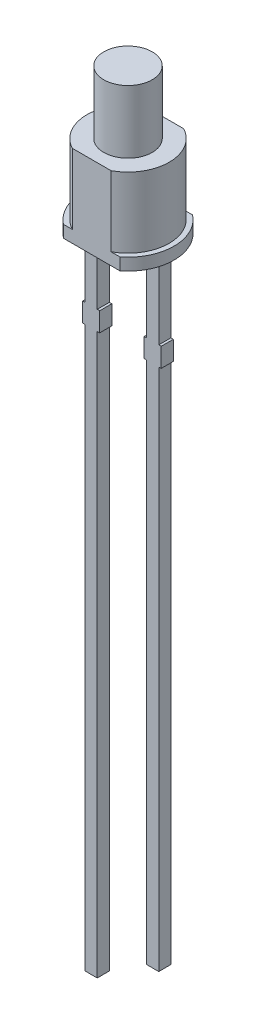
ISO-10303-21;
HEADER;
FILE_DESCRIPTION(('STEP AP214'),'2;1');
FILE_NAME('part.step','',(''),(''),'','','');
FILE_SCHEMA(('AUTOMOTIVE_DESIGN { 1 0 10303 214 1 1 1 1 }'));
ENDSEC;
DATA;
#1=APPLICATION_CONTEXT('core data for automotive mechanical design processes');
#2=APPLICATION_PROTOCOL_DEFINITION('international standard','automotive_design',2000,#1);
#3=PRODUCT_CONTEXT('',#1,'mechanical');
#4=PRODUCT('Part','Part','',(#3));
#5=PRODUCT_RELATED_PRODUCT_CATEGORY('part','',(#4));
#6=PRODUCT_DEFINITION_FORMATION('','',#4);
#7=PRODUCT_DEFINITION_CONTEXT('part definition',#1,'design');
#8=PRODUCT_DEFINITION('design','',#6,#7);
#9=PRODUCT_DEFINITION_SHAPE('','',#8);
#10=(LENGTH_UNIT() NAMED_UNIT(*) SI_UNIT(.MILLI.,.METRE.));
#11=(NAMED_UNIT(*) PLANE_ANGLE_UNIT() SI_UNIT($,.RADIAN.));
#12=(NAMED_UNIT(*) SI_UNIT($,.STERADIAN.) SOLID_ANGLE_UNIT());
#13=UNCERTAINTY_MEASURE_WITH_UNIT(LENGTH_MEASURE(1.E-05),#10,'distance_accuracy_value','');
#14=(GEOMETRIC_REPRESENTATION_CONTEXT(3) GLOBAL_UNCERTAINTY_ASSIGNED_CONTEXT((#13)) GLOBAL_UNIT_ASSIGNED_CONTEXT((#10,
#11,#12)) REPRESENTATION_CONTEXT('',''));
#15=CARTESIAN_POINT('',(0.,0.,0.));
#16=DIRECTION('',(0.,0.,1.));
#17=DIRECTION('',(1.,0.,0.));
#18=AXIS2_PLACEMENT_3D('',#15,#16,#17);
#19=CARTESIAN_POINT('',(0.,0.,0.));
#20=DIRECTION('',(0.,1.,0.));
#21=DIRECTION('',(0.,0.,1.));
#22=AXIS2_PLACEMENT_3D('',#19,#20,#21);
#23=PLANE('',#22);
#24=DIRECTION('',(0.,0.,-1.));
#25=VECTOR('',#24,1.);
#26=CARTESIAN_POINT('',(-1.52,0.,0.25));
#27=LINE('',#26,#25);
#28=CARTESIAN_POINT('',(-1.52,0.,0.25));
#29=VERTEX_POINT('',#28);
#30=CARTESIAN_POINT('',(-1.52,0.,-0.25));
#31=VERTEX_POINT('',#30);
#32=EDGE_CURVE('E362',#29,#31,#27,.T.);
#33=ORIENTED_EDGE('',*,*,#32,.F.);
#34=DIRECTION('',(-1.,0.,0.));
#35=VECTOR('',#34,1.);
#36=CARTESIAN_POINT('',(0.,0.,0.25));
#37=LINE('',#36,#35);
#38=CARTESIAN_POINT('',(-1.02,0.,0.25));
#39=VERTEX_POINT('',#38);
#40=EDGE_CURVE('E428',#39,#29,#37,.T.);
#41=ORIENTED_EDGE('',*,*,#40,.F.);
#42=DIRECTION('',(0.,0.,-1.));
#43=VECTOR('',#42,1.);
#44=CARTESIAN_POINT('',(-1.02,0.,0.25));
#45=LINE('',#44,#43);
#46=CARTESIAN_POINT('',(-1.02,0.,-0.25));
#47=VERTEX_POINT('',#46);
#48=EDGE_CURVE('E360',#39,#47,#45,.T.);
#49=ORIENTED_EDGE('',*,*,#48,.T.);
#50=DIRECTION('',(-1.,0.,0.));
#51=VECTOR('',#50,1.);
#52=CARTESIAN_POINT('',(0.,0.,-0.25));
#53=LINE('',#52,#51);
#54=EDGE_CURVE('E397',#47,#31,#53,.T.);
#55=ORIENTED_EDGE('',*,*,#54,.T.);
#56=EDGE_LOOP('',(#33,#41,#49,#55));
#57=FACE_BOUND('',#56,.T.);
#58=DIRECTION('',(0.,0.,-1.));
#59=VECTOR('',#58,1.);
#60=CARTESIAN_POINT('',(1.52,0.,0.25));
#61=LINE('',#60,#59);
#62=CARTESIAN_POINT('',(1.52,0.,0.25));
#63=VERTEX_POINT('',#62);
#64=CARTESIAN_POINT('',(1.52,0.,-0.25));
#65=VERTEX_POINT('',#64);
#66=EDGE_CURVE('E488',#63,#65,#61,.T.);
#67=ORIENTED_EDGE('',*,*,#66,.T.);
#68=DIRECTION('',(1.,0.,0.));
#69=VECTOR('',#68,1.);
#70=CARTESIAN_POINT('',(0.,0.,-0.25));
#71=LINE('',#70,#69);
#72=CARTESIAN_POINT('',(1.02,0.,-0.25));
#73=VERTEX_POINT('',#72);
#74=EDGE_CURVE('E480',#73,#65,#71,.T.);
#75=ORIENTED_EDGE('',*,*,#74,.F.);
#76=DIRECTION('',(0.,0.,-1.));
#77=VECTOR('',#76,1.);
#78=CARTESIAN_POINT('',(1.02,0.,0.25));
#79=LINE('',#78,#77);
#80=CARTESIAN_POINT('',(1.02,0.,0.25));
#81=VERTEX_POINT('',#80);
#82=EDGE_CURVE('E486',#81,#73,#79,.T.);
#83=ORIENTED_EDGE('',*,*,#82,.F.);
#84=DIRECTION('',(1.,0.,0.));
#85=VECTOR('',#84,1.);
#86=CARTESIAN_POINT('',(0.,0.,0.25));
#87=LINE('',#86,#85);
#88=EDGE_CURVE('E471',#81,#63,#87,.T.);
#89=ORIENTED_EDGE('',*,*,#88,.T.);
#90=EDGE_LOOP('',(#67,#75,#83,#89));
#91=FACE_BOUND('',#90,.T.);
#92=DIRECTION('',(1.,0.,0.));
#93=VECTOR('',#92,1.);
#94=CARTESIAN_POINT('',(-2.62937932062534,0.,-1.5));
#95=LINE('',#94,#93);
#96=CARTESIAN_POINT('',(-1.16619037896906,0.,-1.5));
#97=VERTEX_POINT('',#96);
#98=CARTESIAN_POINT('',(1.16619037896906,0.,-1.5));
#99=VERTEX_POINT('',#98);
#100=EDGE_CURVE('E305',#97,#99,#95,.T.);
#101=ORIENTED_EDGE('',*,*,#100,.T.);
#102=CARTESIAN_POINT('',(0.,0.,0.));
#103=DIRECTION('',(0.,1.,0.));
#104=DIRECTION('',(0.,0.,1.));
#105=AXIS2_PLACEMENT_3D('',#102,#103,#104);
#106=CIRCLE('',#105,1.9);
#107=CARTESIAN_POINT('',(1.16619037896906,0.,1.5));
#108=VERTEX_POINT('',#107);
#109=EDGE_CURVE('E311',#108,#99,#106,.T.);
#110=ORIENTED_EDGE('',*,*,#109,.F.);
#111=DIRECTION('',(-1.,0.,0.));
#112=VECTOR('',#111,1.);
#113=CARTESIAN_POINT('',(-2.62937932062534,0.,1.5));
#114=LINE('',#113,#112);
#115=CARTESIAN_POINT('',(-1.16619037896906,0.,1.5));
#116=VERTEX_POINT('',#115);
#117=EDGE_CURVE('E294',#108,#116,#114,.T.);
#118=ORIENTED_EDGE('',*,*,#117,.T.);
#119=EDGE_CURVE('E318',#97,#116,#106,.T.);
#120=ORIENTED_EDGE('',*,*,#119,.F.);
#121=EDGE_LOOP('',(#101,#110,#118,#120));
#122=FACE_BOUND('',#121,.T.);
#123=ADVANCED_FACE('F88',(#57,#91,#122),#23,.F.);
#124=CARTESIAN_POINT('',(0.,0.5,0.));
#125=DIRECTION('',(0.,-1.,0.));
#126=DIRECTION('',(0.,0.,-1.));
#127=AXIS2_PLACEMENT_3D('',#124,#125,#126);
#128=CYLINDRICAL_SURFACE('',#127,1.9);
#129=DIRECTION('',(0.,-1.,0.));
#130=VECTOR('',#129,1.);
#131=CARTESIAN_POINT('',(1.16619037896906,0.5,-1.5));
#132=LINE('',#131,#130);
#133=CARTESIAN_POINT('',(1.16619037896906,0.5,-1.5));
#134=VERTEX_POINT('',#133);
#135=EDGE_CURVE('E467',#134,#99,#132,.T.);
#136=ORIENTED_EDGE('',*,*,#135,.F.);
#137=CARTESIAN_POINT('',(0.,0.5,0.));
#138=DIRECTION('',(0.,1.,0.));
#139=DIRECTION('',(0.,0.,1.));
#140=AXIS2_PLACEMENT_3D('',#137,#138,#139);
#141=CIRCLE('',#140,1.9);
#142=CARTESIAN_POINT('',(1.16619037896906,0.5,1.5));
#143=VERTEX_POINT('',#142);
#144=EDGE_CURVE('E313',#143,#134,#141,.T.);
#145=ORIENTED_EDGE('',*,*,#144,.F.);
#146=DIRECTION('',(0.,-1.,0.));
#147=VECTOR('',#146,1.);
#148=CARTESIAN_POINT('',(1.16619037896906,0.5,1.5));
#149=LINE('',#148,#147);
#150=EDGE_CURVE('E297',#108,#143,#149,.F.);
#151=ORIENTED_EDGE('',*,*,#150,.F.);
#152=ORIENTED_EDGE('',*,*,#109,.T.);
#153=EDGE_LOOP('',(#136,#145,#151,#152));
#154=FACE_BOUND('',#153,.T.);
#155=ADVANCED_FACE('F90',(#154),#128,.T.);
#156=DIRECTION('',(0.,-1.,0.));
#157=VECTOR('',#156,1.);
#158=CARTESIAN_POINT('',(-1.16619037896906,0.5,-1.5));
#159=LINE('',#158,#157);
#160=CARTESIAN_POINT('',(-1.16619037896906,0.5,-1.5));
#161=VERTEX_POINT('',#160);
#162=EDGE_CURVE('E535',#97,#161,#159,.F.);
#163=ORIENTED_EDGE('',*,*,#162,.F.);
#164=ORIENTED_EDGE('',*,*,#119,.T.);
#165=DIRECTION('',(0.,-1.,0.));
#166=VECTOR('',#165,1.);
#167=CARTESIAN_POINT('',(-1.16619037896906,0.5,1.5));
#168=LINE('',#167,#166);
#169=CARTESIAN_POINT('',(-1.16619037896906,0.5,1.5));
#170=VERTEX_POINT('',#169);
#171=EDGE_CURVE('E300',#170,#116,#168,.T.);
#172=ORIENTED_EDGE('',*,*,#171,.F.);
#173=EDGE_CURVE('E317',#161,#170,#141,.T.);
#174=ORIENTED_EDGE('',*,*,#173,.F.);
#175=EDGE_LOOP('',(#163,#164,#172,#174));
#176=FACE_BOUND('',#175,.T.);
#177=ADVANCED_FACE('F585',(#176),#128,.T.);
#178=CARTESIAN_POINT('',(0.,0.5,0.));
#179=DIRECTION('',(0.,1.,0.));
#180=DIRECTION('',(0.,0.,1.));
#181=AXIS2_PLACEMENT_3D('',#178,#179,#180);
#182=PLANE('',#181);
#183=ORIENTED_EDGE('',*,*,#144,.T.);
#184=DIRECTION('',(-1.,0.,0.));
#185=VECTOR('',#184,1.);
#186=CARTESIAN_POINT('',(0.,0.5,-1.5));
#187=LINE('',#186,#185);
#188=CARTESIAN_POINT('',(0.799999999999999,0.5,-1.5));
#189=VERTEX_POINT('',#188);
#190=EDGE_CURVE('E537',#134,#189,#187,.T.);
#191=ORIENTED_EDGE('',*,*,#190,.T.);
#192=CARTESIAN_POINT('',(0.,0.5,0.));
#193=DIRECTION('',(0.,1.,0.));
#194=DIRECTION('',(0.,0.,1.));
#195=AXIS2_PLACEMENT_3D('',#192,#193,#194);
#196=CIRCLE('',#195,1.7);
#197=CARTESIAN_POINT('',(0.8,0.5,1.5));
#198=VERTEX_POINT('',#197);
#199=EDGE_CURVE('E330',#198,#189,#196,.T.);
#200=ORIENTED_EDGE('',*,*,#199,.F.);
#201=DIRECTION('',(1.,0.,0.));
#202=VECTOR('',#201,1.);
#203=CARTESIAN_POINT('',(0.,0.5,1.5));
#204=LINE('',#203,#202);
#205=EDGE_CURVE('E545',#198,#143,#204,.T.);
#206=ORIENTED_EDGE('',*,*,#205,.T.);
#207=EDGE_LOOP('',(#183,#191,#200,#206));
#208=FACE_BOUND('',#207,.T.);
#209=ADVANCED_FACE('F561',(#208),#182,.T.);
#210=CARTESIAN_POINT('',(-0.799999999999999,0.5,-1.5));
#211=VERTEX_POINT('',#210);
#212=CARTESIAN_POINT('',(-0.8,0.5,1.5));
#213=VERTEX_POINT('',#212);
#214=EDGE_CURVE('E335',#211,#213,#196,.T.);
#215=ORIENTED_EDGE('',*,*,#214,.F.);
#216=EDGE_CURVE('E538',#211,#161,#187,.T.);
#217=ORIENTED_EDGE('',*,*,#216,.T.);
#218=ORIENTED_EDGE('',*,*,#173,.T.);
#219=EDGE_CURVE('E314',#170,#213,#204,.T.);
#220=ORIENTED_EDGE('',*,*,#219,.T.);
#221=EDGE_LOOP('',(#215,#217,#218,#220));
#222=FACE_BOUND('',#221,.T.);
#223=ADVANCED_FACE('F556',(#222),#182,.T.);
#224=CARTESIAN_POINT('',(0.,3.4,0.));
#225=DIRECTION('',(0.,-1.,0.));
#226=DIRECTION('',(0.,0.,-1.));
#227=AXIS2_PLACEMENT_3D('',#224,#225,#226);
#228=CYLINDRICAL_SURFACE('',#227,1.7);
#229=DIRECTION('',(0.,-1.,0.));
#230=VECTOR('',#229,1.);
#231=CARTESIAN_POINT('',(0.799999999999999,3.4,-1.5));
#232=LINE('',#231,#230);
#233=CARTESIAN_POINT('',(0.799999999999999,3.4,-1.5));
#234=VERTEX_POINT('',#233);
#235=EDGE_CURVE('E541',#234,#189,#232,.T.);
#236=ORIENTED_EDGE('',*,*,#235,.F.);
#237=CARTESIAN_POINT('',(0.,3.4,0.));
#238=DIRECTION('',(0.,1.,0.));
#239=DIRECTION('',(0.,0.,1.));
#240=AXIS2_PLACEMENT_3D('',#237,#238,#239);
#241=CIRCLE('',#240,1.7);
#242=CARTESIAN_POINT('',(0.8,3.4,1.5));
#243=VERTEX_POINT('',#242);
#244=EDGE_CURVE('E322',#243,#234,#241,.T.);
#245=ORIENTED_EDGE('',*,*,#244,.F.);
#246=DIRECTION('',(0.,-1.,0.));
#247=VECTOR('',#246,1.);
#248=CARTESIAN_POINT('',(0.8,3.4,1.5));
#249=LINE('',#248,#247);
#250=EDGE_CURVE('E110',#198,#243,#249,.F.);
#251=ORIENTED_EDGE('',*,*,#250,.F.);
#252=ORIENTED_EDGE('',*,*,#199,.T.);
#253=EDGE_LOOP('',(#236,#245,#251,#252));
#254=FACE_BOUND('',#253,.T.);
#255=ADVANCED_FACE('F565',(#254),#228,.T.);
#256=DIRECTION('',(0.,-1.,0.));
#257=VECTOR('',#256,1.);
#258=CARTESIAN_POINT('',(-0.799999999999999,3.4,-1.5));
#259=LINE('',#258,#257);
#260=CARTESIAN_POINT('',(-0.799999999999999,3.4,-1.5));
#261=VERTEX_POINT('',#260);
#262=EDGE_CURVE('E103',#211,#261,#259,.F.);
#263=ORIENTED_EDGE('',*,*,#262,.F.);
#264=ORIENTED_EDGE('',*,*,#214,.T.);
#265=DIRECTION('',(0.,-1.,0.));
#266=VECTOR('',#265,1.);
#267=CARTESIAN_POINT('',(-0.8,3.4,1.5));
#268=LINE('',#267,#266);
#269=CARTESIAN_POINT('',(-0.8,3.4,1.5));
#270=VERTEX_POINT('',#269);
#271=EDGE_CURVE('E547',#270,#213,#268,.T.);
#272=ORIENTED_EDGE('',*,*,#271,.F.);
#273=EDGE_CURVE('E340',#261,#270,#241,.T.);
#274=ORIENTED_EDGE('',*,*,#273,.F.);
#275=EDGE_LOOP('',(#263,#264,#272,#274));
#276=FACE_BOUND('',#275,.T.);
#277=ADVANCED_FACE('F558',(#276),#228,.T.);
#278=CARTESIAN_POINT('',(0.,3.4,0.));
#279=DIRECTION('',(0.,1.,0.));
#280=DIRECTION('',(0.,0.,1.));
#281=AXIS2_PLACEMENT_3D('',#278,#279,#280);
#282=PLANE('',#281);
#283=CARTESIAN_POINT('',(0.,3.4,0.));
#284=DIRECTION('',(0.,1.,0.));
#285=DIRECTION('',(0.,0.,1.));
#286=AXIS2_PLACEMENT_3D('',#283,#284,#285);
#287=CIRCLE('',#286,1.);
#288=CARTESIAN_POINT('',(0.,3.4,1.));
#289=VERTEX_POINT('',#288);
#290=EDGE_CURVE('E324',#289,#289,#287,.T.);
#291=ORIENTED_EDGE('',*,*,#290,.F.);
#292=EDGE_LOOP('',(#291));
#293=FACE_BOUND('',#292,.T.);
#294=ORIENTED_EDGE('',*,*,#244,.T.);
#295=DIRECTION('',(-1.,0.,0.));
#296=VECTOR('',#295,1.);
#297=CARTESIAN_POINT('',(0.,3.4,-1.5));
#298=LINE('',#297,#296);
#299=EDGE_CURVE('E12',#234,#261,#298,.T.);
#300=ORIENTED_EDGE('',*,*,#299,.T.);
#301=ORIENTED_EDGE('',*,*,#273,.T.);
#302=DIRECTION('',(1.,0.,0.));
#303=VECTOR('',#302,1.);
#304=CARTESIAN_POINT('',(0.,3.4,1.5));
#305=LINE('',#304,#303);
#306=EDGE_CURVE('E96',#270,#243,#305,.T.);
#307=ORIENTED_EDGE('',*,*,#306,.T.);
#308=EDGE_LOOP('',(#294,#300,#301,#307));
#309=FACE_BOUND('',#308,.T.);
#310=ADVANCED_FACE('F567',(#293,#309),#282,.T.);
#311=CARTESIAN_POINT('',(0.,6.,0.));
#312=DIRECTION('',(0.,-1.,0.));
#313=DIRECTION('',(0.,0.,-1.));
#314=AXIS2_PLACEMENT_3D('',#311,#312,#313);
#315=CYLINDRICAL_SURFACE('',#314,1.);
#316=CARTESIAN_POINT('',(0.,6.,0.));
#317=DIRECTION('',(0.,1.,0.));
#318=DIRECTION('',(0.,0.,1.));
#319=AXIS2_PLACEMENT_3D('',#316,#317,#318);
#320=CIRCLE('',#319,1.);
#321=CARTESIAN_POINT('',(0.,6.,1.));
#322=VERTEX_POINT('',#321);
#323=EDGE_CURVE('E338',#322,#322,#320,.T.);
#324=ORIENTED_EDGE('',*,*,#323,.F.);
#325=EDGE_LOOP('',(#324));
#326=FACE_BOUND('',#325,.T.);
#327=ORIENTED_EDGE('',*,*,#290,.T.);
#328=EDGE_LOOP('',(#327));
#329=FACE_BOUND('',#328,.T.);
#330=ADVANCED_FACE('F569',(#326,#329),#315,.T.);
#331=CARTESIAN_POINT('',(0.,6.,0.));
#332=DIRECTION('',(0.,1.,0.));
#333=DIRECTION('',(0.,0.,1.));
#334=AXIS2_PLACEMENT_3D('',#331,#332,#333);
#335=PLANE('',#334);
#336=ORIENTED_EDGE('',*,*,#323,.T.);
#337=EDGE_LOOP('',(#336));
#338=FACE_BOUND('',#337,.T.);
#339=ADVANCED_FACE('F576',(#338),#335,.T.);
#340=CARTESIAN_POINT('',(-1.02,0.,0.25));
#341=DIRECTION('',(-1.,0.,0.));
#342=DIRECTION('',(0.,-1.,0.));
#343=AXIS2_PLACEMENT_3D('',#340,#341,#342);
#344=PLANE('',#343);
#345=DIRECTION('',(0.,1.,0.));
#346=VECTOR('',#345,1.);
#347=CARTESIAN_POINT('',(-1.02,0.,-0.25));
#348=LINE('',#347,#346);
#349=CARTESIAN_POINT('',(-1.02,-27.,-0.25));
#350=VERTEX_POINT('',#349);
#351=CARTESIAN_POINT('',(-1.02,-3.88507629563782,-0.25));
#352=VERTEX_POINT('',#351);
#353=EDGE_CURVE('E409',#350,#352,#348,.T.);
#354=ORIENTED_EDGE('',*,*,#353,.T.);
#355=DIRECTION('',(0.,0.,-1.));
#356=VECTOR('',#355,1.);
#357=CARTESIAN_POINT('',(-1.02,-3.88507629563782,0.25));
#358=LINE('',#357,#356);
#359=CARTESIAN_POINT('',(-1.02,-3.88507629563782,0.25));
#360=VERTEX_POINT('',#359);
#361=EDGE_CURVE('E343',#360,#352,#358,.T.);
#362=ORIENTED_EDGE('',*,*,#361,.F.);
#363=DIRECTION('',(0.,1.,0.));
#364=VECTOR('',#363,1.);
#365=CARTESIAN_POINT('',(-1.02,0.,0.25));
#366=LINE('',#365,#364);
#367=CARTESIAN_POINT('',(-1.02,-27.,0.25));
#368=VERTEX_POINT('',#367);
#369=EDGE_CURVE('E381',#368,#360,#366,.T.);
#370=ORIENTED_EDGE('',*,*,#369,.F.);
#371=DIRECTION('',(0.,0.,-1.));
#372=VECTOR('',#371,1.);
#373=CARTESIAN_POINT('',(-1.02,-27.,0.25));
#374=LINE('',#373,#372);
#375=EDGE_CURVE('E375',#368,#350,#374,.T.);
#376=ORIENTED_EDGE('',*,*,#375,.T.);
#377=EDGE_LOOP('',(#354,#362,#370,#376));
#378=FACE_BOUND('',#377,.T.);
#379=ADVANCED_FACE('F880',(#378),#344,.F.);
#380=CARTESIAN_POINT('',(0.,-3.88507629563782,0.25));
#381=DIRECTION('',(0.,-1.,0.));
#382=DIRECTION('',(0.,0.,-1.));
#383=AXIS2_PLACEMENT_3D('',#380,#381,#382);
#384=PLANE('',#383);
#385=DIRECTION('',(-1.,0.,0.));
#386=VECTOR('',#385,1.);
#387=CARTESIAN_POINT('',(0.,-3.88507629563782,-0.25));
#388=LINE('',#387,#386);
#389=CARTESIAN_POINT('',(-0.920000000000001,-3.88507629563782,-0.25));
#390=VERTEX_POINT('',#389);
#391=EDGE_CURVE('E406',#390,#352,#388,.T.);
#392=ORIENTED_EDGE('',*,*,#391,.F.);
#393=DIRECTION('',(0.,0.,-1.));
#394=VECTOR('',#393,1.);
#395=CARTESIAN_POINT('',(-0.920000000000001,-3.88507629563782,0.25));
#396=LINE('',#395,#394);
#397=CARTESIAN_POINT('',(-0.920000000000001,-3.88507629563782,0.25));
#398=VERTEX_POINT('',#397);
#399=EDGE_CURVE('E346',#398,#390,#396,.T.);
#400=ORIENTED_EDGE('',*,*,#399,.F.);
#401=DIRECTION('',(-1.,0.,0.));
#402=VECTOR('',#401,1.);
#403=CARTESIAN_POINT('',(0.,-3.88507629563782,0.25));
#404=LINE('',#403,#402);
#405=EDGE_CURVE('E438',#398,#360,#404,.T.);
#406=ORIENTED_EDGE('',*,*,#405,.T.);
#407=ORIENTED_EDGE('',*,*,#361,.T.);
#408=EDGE_LOOP('',(#392,#400,#406,#407));
#409=FACE_BOUND('',#408,.T.);
#410=ADVANCED_FACE('F870',(#409),#384,.T.);
#411=CARTESIAN_POINT('',(-0.920000000000001,0.,0.25));
#412=DIRECTION('',(-1.,0.,0.));
#413=DIRECTION('',(0.,0.,1.));
#414=AXIS2_PLACEMENT_3D('',#411,#412,#413);
#415=PLANE('',#414);
#416=DIRECTION('',(0.,1.,0.));
#417=VECTOR('',#416,1.);
#418=CARTESIAN_POINT('',(-0.920000000000001,0.,-0.25));
#419=LINE('',#418,#417);
#420=CARTESIAN_POINT('',(-0.920000000000001,-3.09374978998299,-0.25));
#421=VERTEX_POINT('',#420);
#422=EDGE_CURVE('E404',#390,#421,#419,.T.);
#423=ORIENTED_EDGE('',*,*,#422,.T.);
#424=DIRECTION('',(0.,0.,-1.));
#425=VECTOR('',#424,1.);
#426=CARTESIAN_POINT('',(-0.920000000000001,-3.09374978998299,0.25));
#427=LINE('',#426,#425);
#428=CARTESIAN_POINT('',(-0.920000000000001,-3.09374978998299,0.25));
#429=VERTEX_POINT('',#428);
#430=EDGE_CURVE('E352',#429,#421,#427,.T.);
#431=ORIENTED_EDGE('',*,*,#430,.F.);
#432=DIRECTION('',(0.,1.,0.));
#433=VECTOR('',#432,1.);
#434=CARTESIAN_POINT('',(-0.920000000000001,0.,0.25));
#435=LINE('',#434,#433);
#436=EDGE_CURVE('E436',#398,#429,#435,.T.);
#437=ORIENTED_EDGE('',*,*,#436,.F.);
#438=ORIENTED_EDGE('',*,*,#399,.T.);
#439=EDGE_LOOP('',(#423,#431,#437,#438));
#440=FACE_BOUND('',#439,.T.);
#441=ADVANCED_FACE('F860',(#440),#415,.F.);
#442=CARTESIAN_POINT('',(0.,-3.09374978998299,0.25));
#443=DIRECTION('',(0.,-1.,0.));
#444=DIRECTION('',(0.,0.,-1.));
#445=AXIS2_PLACEMENT_3D('',#442,#443,#444);
#446=PLANE('',#445);
#447=DIRECTION('',(-1.,0.,0.));
#448=VECTOR('',#447,1.);
#449=CARTESIAN_POINT('',(0.,-3.09374978998299,-0.25));
#450=LINE('',#449,#448);
#451=CARTESIAN_POINT('',(-1.02,-3.09374978998299,-0.25));
#452=VERTEX_POINT('',#451);
#453=EDGE_CURVE('E402',#421,#452,#450,.T.);
#454=ORIENTED_EDGE('',*,*,#453,.T.);
#455=DIRECTION('',(0.,0.,-1.));
#456=VECTOR('',#455,1.);
#457=CARTESIAN_POINT('',(-1.02,-3.09374978998299,0.25));
#458=LINE('',#457,#456);
#459=CARTESIAN_POINT('',(-1.02,-3.09374978998299,0.25));
#460=VERTEX_POINT('',#459);
#461=EDGE_CURVE('E357',#460,#452,#458,.T.);
#462=ORIENTED_EDGE('',*,*,#461,.F.);
#463=DIRECTION('',(-1.,0.,0.));
#464=VECTOR('',#463,1.);
#465=CARTESIAN_POINT('',(0.,-3.09374978998299,0.25));
#466=LINE('',#465,#464);
#467=EDGE_CURVE('E434',#429,#460,#466,.T.);
#468=ORIENTED_EDGE('',*,*,#467,.F.);
#469=ORIENTED_EDGE('',*,*,#430,.T.);
#470=EDGE_LOOP('',(#454,#462,#468,#469));
#471=FACE_BOUND('',#470,.T.);
#472=ADVANCED_FACE('F850',(#471),#446,.F.);
#473=CARTESIAN_POINT('',(-1.02,0.,0.25));
#474=DIRECTION('',(-1.,0.,0.));
#475=DIRECTION('',(0.,-1.,0.));
#476=AXIS2_PLACEMENT_3D('',#473,#474,#475);
#477=PLANE('',#476);
#478=DIRECTION('',(0.,1.,0.));
#479=VECTOR('',#478,1.);
#480=CARTESIAN_POINT('',(-1.02,0.,-0.25));
#481=LINE('',#480,#479);
#482=EDGE_CURVE('E399',#452,#47,#481,.T.);
#483=ORIENTED_EDGE('',*,*,#482,.T.);
#484=ORIENTED_EDGE('',*,*,#48,.F.);
#485=DIRECTION('',(0.,1.,0.));
#486=VECTOR('',#485,1.);
#487=CARTESIAN_POINT('',(-1.02,0.,0.25));
#488=LINE('',#487,#486);
#489=EDGE_CURVE('E431',#460,#39,#488,.T.);
#490=ORIENTED_EDGE('',*,*,#489,.F.);
#491=ORIENTED_EDGE('',*,*,#461,.T.);
#492=EDGE_LOOP('',(#483,#484,#490,#491));
#493=FACE_BOUND('',#492,.T.);
#494=ADVANCED_FACE('F840',(#493),#477,.F.);
#495=CARTESIAN_POINT('',(-1.52,0.,0.25));
#496=DIRECTION('',(-1.,0.,0.));
#497=DIRECTION('',(0.,0.,1.));
#498=AXIS2_PLACEMENT_3D('',#495,#496,#497);
#499=PLANE('',#498);
#500=DIRECTION('',(0.,1.,0.));
#501=VECTOR('',#500,1.);
#502=CARTESIAN_POINT('',(-1.52,0.,-0.25));
#503=LINE('',#502,#501);
#504=CARTESIAN_POINT('',(-1.52,-3.09374978998299,-0.25));
#505=VERTEX_POINT('',#504);
#506=EDGE_CURVE('E394',#505,#31,#503,.T.);
#507=ORIENTED_EDGE('',*,*,#506,.F.);
#508=DIRECTION('',(0.,0.,-1.));
#509=VECTOR('',#508,1.);
#510=CARTESIAN_POINT('',(-1.52,-3.09374978998299,0.25));
#511=LINE('',#510,#509);
#512=CARTESIAN_POINT('',(-1.52,-3.09374978998299,0.25));
#513=VERTEX_POINT('',#512);
#514=EDGE_CURVE('E365',#513,#505,#511,.T.);
#515=ORIENTED_EDGE('',*,*,#514,.F.);
#516=DIRECTION('',(0.,1.,0.));
#517=VECTOR('',#516,1.);
#518=CARTESIAN_POINT('',(-1.52,0.,0.25));
#519=LINE('',#518,#517);
#520=EDGE_CURVE('E425',#513,#29,#519,.T.);
#521=ORIENTED_EDGE('',*,*,#520,.T.);
#522=ORIENTED_EDGE('',*,*,#32,.T.);
#523=EDGE_LOOP('',(#507,#515,#521,#522));
#524=FACE_BOUND('',#523,.T.);
#525=ADVANCED_FACE('F830',(#524),#499,.T.);
#526=CARTESIAN_POINT('',(0.,-3.09374978998299,0.25));
#527=DIRECTION('',(0.,-1.,0.));
#528=DIRECTION('',(0.,0.,-1.));
#529=AXIS2_PLACEMENT_3D('',#526,#527,#528);
#530=PLANE('',#529);
#531=DIRECTION('',(-1.,0.,0.));
#532=VECTOR('',#531,1.);
#533=CARTESIAN_POINT('',(0.,-3.09374978998299,-0.25));
#534=LINE('',#533,#532);
#535=CARTESIAN_POINT('',(-1.62,-3.09374978998299,-0.25));
#536=VERTEX_POINT('',#535);
#537=EDGE_CURVE('E391',#505,#536,#534,.T.);
#538=ORIENTED_EDGE('',*,*,#537,.T.);
#539=DIRECTION('',(0.,0.,-1.));
#540=VECTOR('',#539,1.);
#541=CARTESIAN_POINT('',(-1.62,-3.09374978998299,0.25));
#542=LINE('',#541,#540);
#543=CARTESIAN_POINT('',(-1.62,-3.09374978998299,0.25));
#544=VERTEX_POINT('',#543);
#545=EDGE_CURVE('E367',#544,#536,#542,.T.);
#546=ORIENTED_EDGE('',*,*,#545,.F.);
#547=DIRECTION('',(-1.,0.,0.));
#548=VECTOR('',#547,1.);
#549=CARTESIAN_POINT('',(0.,-3.09374978998299,0.25));
#550=LINE('',#549,#548);
#551=EDGE_CURVE('E423',#513,#544,#550,.T.);
#552=ORIENTED_EDGE('',*,*,#551,.F.);
#553=ORIENTED_EDGE('',*,*,#514,.T.);
#554=EDGE_LOOP('',(#538,#546,#552,#553));
#555=FACE_BOUND('',#554,.T.);
#556=ADVANCED_FACE('F820',(#555),#530,.F.);
#557=CARTESIAN_POINT('',(-1.62,0.,0.25));
#558=DIRECTION('',(-1.,0.,0.));
#559=DIRECTION('',(0.,0.,1.));
#560=AXIS2_PLACEMENT_3D('',#557,#558,#559);
#561=PLANE('',#560);
#562=DIRECTION('',(0.,1.,0.));
#563=VECTOR('',#562,1.);
#564=CARTESIAN_POINT('',(-1.62,0.,-0.25));
#565=LINE('',#564,#563);
#566=CARTESIAN_POINT('',(-1.62,-3.88507629563782,-0.25));
#567=VERTEX_POINT('',#566);
#568=EDGE_CURVE('E388',#567,#536,#565,.T.);
#569=ORIENTED_EDGE('',*,*,#568,.F.);
#570=DIRECTION('',(0.,0.,-1.));
#571=VECTOR('',#570,1.);
#572=CARTESIAN_POINT('',(-1.62,-3.88507629563782,0.25));
#573=LINE('',#572,#571);
#574=CARTESIAN_POINT('',(-1.62,-3.88507629563782,0.25));
#575=VERTEX_POINT('',#574);
#576=EDGE_CURVE('E369',#575,#567,#573,.T.);
#577=ORIENTED_EDGE('',*,*,#576,.F.);
#578=DIRECTION('',(0.,1.,0.));
#579=VECTOR('',#578,1.);
#580=CARTESIAN_POINT('',(-1.62,0.,0.25));
#581=LINE('',#580,#579);
#582=EDGE_CURVE('E420',#575,#544,#581,.T.);
#583=ORIENTED_EDGE('',*,*,#582,.T.);
#584=ORIENTED_EDGE('',*,*,#545,.T.);
#585=EDGE_LOOP('',(#569,#577,#583,#584));
#586=FACE_BOUND('',#585,.T.);
#587=ADVANCED_FACE('F810',(#586),#561,.T.);
#588=CARTESIAN_POINT('',(0.,-3.88507629563782,0.25));
#589=DIRECTION('',(0.,-1.,0.));
#590=DIRECTION('',(0.,0.,-1.));
#591=AXIS2_PLACEMENT_3D('',#588,#589,#590);
#592=PLANE('',#591);
#593=DIRECTION('',(-1.,0.,0.));
#594=VECTOR('',#593,1.);
#595=CARTESIAN_POINT('',(0.,-3.88507629563782,-0.25));
#596=LINE('',#595,#594);
#597=CARTESIAN_POINT('',(-1.52,-3.88507629563782,-0.25));
#598=VERTEX_POINT('',#597);
#599=EDGE_CURVE('E385',#598,#567,#596,.T.);
#600=ORIENTED_EDGE('',*,*,#599,.F.);
#601=DIRECTION('',(0.,0.,-1.));
#602=VECTOR('',#601,1.);
#603=CARTESIAN_POINT('',(-1.52,-3.88507629563782,0.25));
#604=LINE('',#603,#602);
#605=CARTESIAN_POINT('',(-1.52,-3.88507629563782,0.25));
#606=VERTEX_POINT('',#605);
#607=EDGE_CURVE('E371',#606,#598,#604,.T.);
#608=ORIENTED_EDGE('',*,*,#607,.F.);
#609=DIRECTION('',(-1.,0.,0.));
#610=VECTOR('',#609,1.);
#611=CARTESIAN_POINT('',(0.,-3.88507629563782,0.25));
#612=LINE('',#611,#610);
#613=EDGE_CURVE('E417',#606,#575,#612,.T.);
#614=ORIENTED_EDGE('',*,*,#613,.T.);
#615=ORIENTED_EDGE('',*,*,#576,.T.);
#616=EDGE_LOOP('',(#600,#608,#614,#615));
#617=FACE_BOUND('',#616,.T.);
#618=ADVANCED_FACE('F800',(#617),#592,.T.);
#619=CARTESIAN_POINT('',(-1.52,0.,0.25));
#620=DIRECTION('',(-1.,0.,0.));
#621=DIRECTION('',(0.,0.,1.));
#622=AXIS2_PLACEMENT_3D('',#619,#620,#621);
#623=PLANE('',#622);
#624=DIRECTION('',(0.,1.,0.));
#625=VECTOR('',#624,1.);
#626=CARTESIAN_POINT('',(-1.52,0.,-0.25));
#627=LINE('',#626,#625);
#628=CARTESIAN_POINT('',(-1.52,-27.,-0.25));
#629=VERTEX_POINT('',#628);
#630=EDGE_CURVE('E382',#629,#598,#627,.T.);
#631=ORIENTED_EDGE('',*,*,#630,.F.);
#632=DIRECTION('',(0.,0.,-1.));
#633=VECTOR('',#632,1.);
#634=CARTESIAN_POINT('',(-1.52,-27.,0.25));
#635=LINE('',#634,#633);
#636=CARTESIAN_POINT('',(-1.52,-27.,0.25));
#637=VERTEX_POINT('',#636);
#638=EDGE_CURVE('E373',#637,#629,#635,.T.);
#639=ORIENTED_EDGE('',*,*,#638,.F.);
#640=DIRECTION('',(0.,1.,0.));
#641=VECTOR('',#640,1.);
#642=CARTESIAN_POINT('',(-1.52,0.,0.25));
#643=LINE('',#642,#641);
#644=EDGE_CURVE('E414',#637,#606,#643,.T.);
#645=ORIENTED_EDGE('',*,*,#644,.T.);
#646=ORIENTED_EDGE('',*,*,#607,.T.);
#647=EDGE_LOOP('',(#631,#639,#645,#646));
#648=FACE_BOUND('',#647,.T.);
#649=ADVANCED_FACE('F789',(#648),#623,.T.);
#650=CARTESIAN_POINT('',(0.,-27.,0.25));
#651=DIRECTION('',(0.,-1.,0.));
#652=DIRECTION('',(0.,0.,-1.));
#653=AXIS2_PLACEMENT_3D('',#650,#651,#652);
#654=PLANE('',#653);
#655=DIRECTION('',(-1.,0.,0.));
#656=VECTOR('',#655,1.);
#657=CARTESIAN_POINT('',(0.,-27.,-0.25));
#658=LINE('',#657,#656);
#659=EDGE_CURVE('E378',#350,#629,#658,.T.);
#660=ORIENTED_EDGE('',*,*,#659,.F.);
#661=ORIENTED_EDGE('',*,*,#375,.F.);
#662=DIRECTION('',(-1.,0.,0.));
#663=VECTOR('',#662,1.);
#664=CARTESIAN_POINT('',(0.,-27.,0.25));
#665=LINE('',#664,#663);
#666=EDGE_CURVE('E377',#368,#637,#665,.T.);
#667=ORIENTED_EDGE('',*,*,#666,.T.);
#668=ORIENTED_EDGE('',*,*,#638,.T.);
#669=EDGE_LOOP('',(#660,#661,#667,#668));
#670=FACE_BOUND('',#669,.T.);
#671=ADVANCED_FACE('F777',(#670),#654,.T.);
#672=CARTESIAN_POINT('',(0.,0.,0.25));
#673=DIRECTION('',(0.,0.,1.));
#674=DIRECTION('',(1.,0.,0.));
#675=AXIS2_PLACEMENT_3D('',#672,#673,#674);
#676=PLANE('',#675);
#677=ORIENTED_EDGE('',*,*,#369,.T.);
#678=ORIENTED_EDGE('',*,*,#405,.F.);
#679=ORIENTED_EDGE('',*,*,#436,.T.);
#680=ORIENTED_EDGE('',*,*,#467,.T.);
#681=ORIENTED_EDGE('',*,*,#489,.T.);
#682=ORIENTED_EDGE('',*,*,#40,.T.);
#683=ORIENTED_EDGE('',*,*,#520,.F.);
#684=ORIENTED_EDGE('',*,*,#551,.T.);
#685=ORIENTED_EDGE('',*,*,#582,.F.);
#686=ORIENTED_EDGE('',*,*,#613,.F.);
#687=ORIENTED_EDGE('',*,*,#644,.F.);
#688=ORIENTED_EDGE('',*,*,#666,.F.);
#689=EDGE_LOOP('',(#677,#678,#679,#680,#681,#682,#683,#684,#685,#686,#687,#688));
#690=FACE_BOUND('',#689,.T.);
#691=ADVANCED_FACE('F766',(#690),#676,.T.);
#692=CARTESIAN_POINT('',(0.,0.,-0.25));
#693=DIRECTION('',(0.,0.,1.));
#694=DIRECTION('',(1.,0.,0.));
#695=AXIS2_PLACEMENT_3D('',#692,#693,#694);
#696=PLANE('',#695);
#697=ORIENTED_EDGE('',*,*,#353,.F.);
#698=ORIENTED_EDGE('',*,*,#659,.T.);
#699=ORIENTED_EDGE('',*,*,#630,.T.);
#700=ORIENTED_EDGE('',*,*,#599,.T.);
#701=ORIENTED_EDGE('',*,*,#568,.T.);
#702=ORIENTED_EDGE('',*,*,#537,.F.);
#703=ORIENTED_EDGE('',*,*,#506,.T.);
#704=ORIENTED_EDGE('',*,*,#54,.F.);
#705=ORIENTED_EDGE('',*,*,#482,.F.);
#706=ORIENTED_EDGE('',*,*,#453,.F.);
#707=ORIENTED_EDGE('',*,*,#422,.F.);
#708=ORIENTED_EDGE('',*,*,#391,.T.);
#709=EDGE_LOOP('',(#697,#698,#699,#700,#701,#702,#703,#704,#705,#706,#707,#708));
#710=FACE_BOUND('',#709,.T.);
#711=ADVANCED_FACE('F706',(#710),#696,.F.);
#712=CARTESIAN_POINT('',(1.52,0.,0.25));
#713=DIRECTION('',(-1.,0.,0.));
#714=DIRECTION('',(0.,-1.,0.));
#715=AXIS2_PLACEMENT_3D('',#712,#713,#714);
#716=PLANE('',#715);
#717=DIRECTION('',(0.,1.,0.));
#718=VECTOR('',#717,1.);
#719=CARTESIAN_POINT('',(1.52,0.,-0.25));
#720=LINE('',#719,#718);
#721=CARTESIAN_POINT('',(1.52,-25.5,-0.25));
#722=VERTEX_POINT('',#721);
#723=CARTESIAN_POINT('',(1.52,-3.88507629563782,-0.25));
#724=VERTEX_POINT('',#723);
#725=EDGE_CURVE('E451',#722,#724,#720,.T.);
#726=ORIENTED_EDGE('',*,*,#725,.T.);
#727=DIRECTION('',(0.,0.,-1.));
#728=VECTOR('',#727,1.);
#729=CARTESIAN_POINT('',(1.52,-3.88507629563782,0.25));
#730=LINE('',#729,#728);
#731=CARTESIAN_POINT('',(1.52,-3.88507629563782,0.25));
#732=VERTEX_POINT('',#731);
#733=EDGE_CURVE('E465',#732,#724,#730,.T.);
#734=ORIENTED_EDGE('',*,*,#733,.F.);
#735=DIRECTION('',(0.,1.,0.));
#736=VECTOR('',#735,1.);
#737=CARTESIAN_POINT('',(1.52,0.,0.25));
#738=LINE('',#737,#736);
#739=CARTESIAN_POINT('',(1.52,-25.5,0.25));
#740=VERTEX_POINT('',#739);
#741=EDGE_CURVE('E441',#740,#732,#738,.T.);
#742=ORIENTED_EDGE('',*,*,#741,.F.);
#743=DIRECTION('',(0.,0.,-1.));
#744=VECTOR('',#743,1.);
#745=CARTESIAN_POINT('',(1.52,-25.5,0.25));
#746=LINE('',#745,#744);
#747=EDGE_CURVE('E450',#740,#722,#746,.T.);
#748=ORIENTED_EDGE('',*,*,#747,.T.);
#749=EDGE_LOOP('',(#726,#734,#742,#748));
#750=FACE_BOUND('',#749,.T.);
#751=ADVANCED_FACE('F663',(#750),#716,.F.);
#752=CARTESIAN_POINT('',(1.02,0.,0.25));
#753=DIRECTION('',(-1.,0.,0.));
#754=DIRECTION('',(0.,-1.,0.));
#755=AXIS2_PLACEMENT_3D('',#752,#753,#754);
#756=PLANE('',#755);
#757=DIRECTION('',(0.,1.,0.));
#758=VECTOR('',#757,1.);
#759=CARTESIAN_POINT('',(1.02,0.,-0.25));
#760=LINE('',#759,#758);
#761=CARTESIAN_POINT('',(1.02,-25.5,-0.25));
#762=VERTEX_POINT('',#761);
#763=CARTESIAN_POINT('',(1.02,-3.88507629563782,-0.25));
#764=VERTEX_POINT('',#763);
#765=EDGE_CURVE('E455',#762,#764,#760,.T.);
#766=ORIENTED_EDGE('',*,*,#765,.F.);
#767=DIRECTION('',(0.,0.,-1.));
#768=VECTOR('',#767,1.);
#769=CARTESIAN_POINT('',(1.02,-25.5,0.25));
#770=LINE('',#769,#768);
#771=CARTESIAN_POINT('',(1.02,-25.5,0.25));
#772=VERTEX_POINT('',#771);
#773=EDGE_CURVE('E461',#772,#762,#770,.T.);
#774=ORIENTED_EDGE('',*,*,#773,.F.);
#775=DIRECTION('',(0.,1.,0.));
#776=VECTOR('',#775,1.);
#777=CARTESIAN_POINT('',(1.02,0.,0.25));
#778=LINE('',#777,#776);
#779=CARTESIAN_POINT('',(1.02,-3.88507629563782,0.25));
#780=VERTEX_POINT('',#779);
#781=EDGE_CURVE('E445',#772,#780,#778,.T.);
#782=ORIENTED_EDGE('',*,*,#781,.T.);
#783=DIRECTION('',(0.,0.,-1.));
#784=VECTOR('',#783,1.);
#785=CARTESIAN_POINT('',(1.02,-3.88507629563782,0.25));
#786=LINE('',#785,#784);
#787=EDGE_CURVE('E463',#780,#764,#786,.T.);
#788=ORIENTED_EDGE('',*,*,#787,.T.);
#789=EDGE_LOOP('',(#766,#774,#782,#788));
#790=FACE_BOUND('',#789,.T.);
#791=ADVANCED_FACE('F737',(#790),#756,.T.);
#792=CARTESIAN_POINT('',(0.,-25.5,0.25));
#793=DIRECTION('',(0.,1.,0.));
#794=DIRECTION('',(0.,0.,1.));
#795=AXIS2_PLACEMENT_3D('',#792,#793,#794);
#796=PLANE('',#795);
#797=DIRECTION('',(1.,0.,0.));
#798=VECTOR('',#797,1.);
#799=CARTESIAN_POINT('',(0.,-25.5,-0.25));
#800=LINE('',#799,#798);
#801=EDGE_CURVE('E444',#762,#722,#800,.T.);
#802=ORIENTED_EDGE('',*,*,#801,.T.);
#803=ORIENTED_EDGE('',*,*,#747,.F.);
#804=DIRECTION('',(1.,0.,0.));
#805=VECTOR('',#804,1.);
#806=CARTESIAN_POINT('',(0.,-25.5,0.25));
#807=LINE('',#806,#805);
#808=EDGE_CURVE('E448',#772,#740,#807,.T.);
#809=ORIENTED_EDGE('',*,*,#808,.F.);
#810=ORIENTED_EDGE('',*,*,#773,.T.);
#811=EDGE_LOOP('',(#802,#803,#809,#810));
#812=FACE_BOUND('',#811,.T.);
#813=ADVANCED_FACE('F725',(#812),#796,.F.);
#814=CARTESIAN_POINT('',(0.,0.,0.25));
#815=DIRECTION('',(0.,0.,1.));
#816=DIRECTION('',(1.,0.,0.));
#817=AXIS2_PLACEMENT_3D('',#814,#815,#816);
#818=PLANE('',#817);
#819=ORIENTED_EDGE('',*,*,#741,.T.);
#820=DIRECTION('',(-1.,0.,0.));
#821=VECTOR('',#820,1.);
#822=CARTESIAN_POINT('',(0.,-3.88507629563782,0.25));
#823=LINE('',#822,#821);
#824=CARTESIAN_POINT('',(1.62,-3.88507629563782,0.25));
#825=VERTEX_POINT('',#824);
#826=EDGE_CURVE('E499',#825,#732,#823,.T.);
#827=ORIENTED_EDGE('',*,*,#826,.F.);
#828=DIRECTION('',(0.,1.,0.));
#829=VECTOR('',#828,1.);
#830=CARTESIAN_POINT('',(1.62,0.,0.25));
#831=LINE('',#830,#829);
#832=CARTESIAN_POINT('',(1.62,-3.09374978998299,0.25));
#833=VERTEX_POINT('',#832);
#834=EDGE_CURVE('E492',#825,#833,#831,.T.);
#835=ORIENTED_EDGE('',*,*,#834,.T.);
#836=DIRECTION('',(-1.,0.,0.));
#837=VECTOR('',#836,1.);
#838=CARTESIAN_POINT('',(0.,-3.09374978998299,0.25));
#839=LINE('',#838,#837);
#840=CARTESIAN_POINT('',(1.52,-3.09374978998299,0.25));
#841=VERTEX_POINT('',#840);
#842=EDGE_CURVE('E496',#833,#841,#839,.T.);
#843=ORIENTED_EDGE('',*,*,#842,.T.);
#844=DIRECTION('',(0.,1.,0.));
#845=VECTOR('',#844,1.);
#846=CARTESIAN_POINT('',(1.52,0.,0.25));
#847=LINE('',#846,#845);
#848=EDGE_CURVE('E468',#841,#63,#847,.T.);
#849=ORIENTED_EDGE('',*,*,#848,.T.);
#850=ORIENTED_EDGE('',*,*,#88,.F.);
#851=DIRECTION('',(0.,1.,0.));
#852=VECTOR('',#851,1.);
#853=CARTESIAN_POINT('',(1.02,0.,0.25));
#854=LINE('',#853,#852);
#855=CARTESIAN_POINT('',(1.02,-3.09374978998299,0.25));
#856=VERTEX_POINT('',#855);
#857=EDGE_CURVE('E474',#856,#81,#854,.T.);
#858=ORIENTED_EDGE('',*,*,#857,.F.);
#859=DIRECTION('',(-1.,0.,0.));
#860=VECTOR('',#859,1.);
#861=CARTESIAN_POINT('',(0.,-3.09374978998299,0.25));
#862=LINE('',#861,#860);
#863=CARTESIAN_POINT('',(0.920000000000001,-3.09374978998299,0.25));
#864=VERTEX_POINT('',#863);
#865=EDGE_CURVE('E522',#856,#864,#862,.T.);
#866=ORIENTED_EDGE('',*,*,#865,.T.);
#867=DIRECTION('',(0.,1.,0.));
#868=VECTOR('',#867,1.);
#869=CARTESIAN_POINT('',(0.920000000000001,0.,0.25));
#870=LINE('',#869,#868);
#871=CARTESIAN_POINT('',(0.920000000000001,-3.88507629563782,0.25));
#872=VERTEX_POINT('',#871);
#873=EDGE_CURVE('E515',#872,#864,#870,.T.);
#874=ORIENTED_EDGE('',*,*,#873,.F.);
#875=DIRECTION('',(-1.,0.,0.));
#876=VECTOR('',#875,1.);
#877=CARTESIAN_POINT('',(0.,-3.88507629563782,0.25));
#878=LINE('',#877,#876);
#879=EDGE_CURVE('E519',#780,#872,#878,.T.);
#880=ORIENTED_EDGE('',*,*,#879,.F.);
#881=ORIENTED_EDGE('',*,*,#781,.F.);
#882=ORIENTED_EDGE('',*,*,#808,.T.);
#883=EDGE_LOOP('',(#819,#827,#835,#843,#849,#850,#858,#866,#874,#880,#881,#882));
#884=FACE_BOUND('',#883,.T.);
#885=ADVANCED_FACE('F714',(#884),#818,.T.);
#886=CARTESIAN_POINT('',(0.,0.,-0.25));
#887=DIRECTION('',(0.,0.,1.));
#888=DIRECTION('',(1.,0.,0.));
#889=AXIS2_PLACEMENT_3D('',#886,#887,#888);
#890=PLANE('',#889);
#891=ORIENTED_EDGE('',*,*,#725,.F.);
#892=ORIENTED_EDGE('',*,*,#801,.F.);
#893=ORIENTED_EDGE('',*,*,#765,.T.);
#894=DIRECTION('',(-1.,0.,0.));
#895=VECTOR('',#894,1.);
#896=CARTESIAN_POINT('',(0.,-3.88507629563782,-0.25));
#897=LINE('',#896,#895);
#898=CARTESIAN_POINT('',(0.920000000000001,-3.88507629563782,-0.25));
#899=VERTEX_POINT('',#898);
#900=EDGE_CURVE('E527',#764,#899,#897,.T.);
#901=ORIENTED_EDGE('',*,*,#900,.T.);
#902=DIRECTION('',(0.,1.,0.));
#903=VECTOR('',#902,1.);
#904=CARTESIAN_POINT('',(0.920000000000001,0.,-0.25));
#905=LINE('',#904,#903);
#906=CARTESIAN_POINT('',(0.920000000000001,-3.09374978998299,-0.25));
#907=VERTEX_POINT('',#906);
#908=EDGE_CURVE('E411',#899,#907,#905,.T.);
#909=ORIENTED_EDGE('',*,*,#908,.T.);
#910=DIRECTION('',(-1.,0.,0.));
#911=VECTOR('',#910,1.);
#912=CARTESIAN_POINT('',(0.,-3.09374978998299,-0.25));
#913=LINE('',#912,#911);
#914=CARTESIAN_POINT('',(1.02,-3.09374978998299,-0.25));
#915=VERTEX_POINT('',#914);
#916=EDGE_CURVE('E518',#915,#907,#913,.T.);
#917=ORIENTED_EDGE('',*,*,#916,.F.);
#918=DIRECTION('',(0.,1.,0.));
#919=VECTOR('',#918,1.);
#920=CARTESIAN_POINT('',(1.02,0.,-0.25));
#921=LINE('',#920,#919);
#922=EDGE_CURVE('E470',#915,#73,#921,.T.);
#923=ORIENTED_EDGE('',*,*,#922,.T.);
#924=ORIENTED_EDGE('',*,*,#74,.T.);
#925=DIRECTION('',(0.,1.,0.));
#926=VECTOR('',#925,1.);
#927=CARTESIAN_POINT('',(1.52,0.,-0.25));
#928=LINE('',#927,#926);
#929=CARTESIAN_POINT('',(1.52,-3.09374978998299,-0.25));
#930=VERTEX_POINT('',#929);
#931=EDGE_CURVE('E477',#930,#65,#928,.T.);
#932=ORIENTED_EDGE('',*,*,#931,.F.);
#933=DIRECTION('',(-1.,0.,0.));
#934=VECTOR('',#933,1.);
#935=CARTESIAN_POINT('',(0.,-3.09374978998299,-0.25));
#936=LINE('',#935,#934);
#937=CARTESIAN_POINT('',(1.62,-3.09374978998299,-0.25));
#938=VERTEX_POINT('',#937);
#939=EDGE_CURVE('E507',#938,#930,#936,.T.);
#940=ORIENTED_EDGE('',*,*,#939,.F.);
#941=DIRECTION('',(0.,1.,0.));
#942=VECTOR('',#941,1.);
#943=CARTESIAN_POINT('',(1.62,0.,-0.25));
#944=LINE('',#943,#942);
#945=CARTESIAN_POINT('',(1.62,-3.88507629563782,-0.25));
#946=VERTEX_POINT('',#945);
#947=EDGE_CURVE('E503',#946,#938,#944,.T.);
#948=ORIENTED_EDGE('',*,*,#947,.F.);
#949=DIRECTION('',(-1.,0.,0.));
#950=VECTOR('',#949,1.);
#951=CARTESIAN_POINT('',(0.,-3.88507629563782,-0.25));
#952=LINE('',#951,#950);
#953=EDGE_CURVE('E495',#946,#724,#952,.T.);
#954=ORIENTED_EDGE('',*,*,#953,.T.);
#955=EDGE_LOOP('',(#891,#892,#893,#901,#909,#917,#923,#924,#932,#940,#948,#954));
#956=FACE_BOUND('',#955,.T.);
#957=ADVANCED_FACE('F703',(#956),#890,.F.);
#958=CARTESIAN_POINT('',(1.52,0.,0.25));
#959=DIRECTION('',(-1.,0.,0.));
#960=DIRECTION('',(0.,-1.,0.));
#961=AXIS2_PLACEMENT_3D('',#958,#959,#960);
#962=PLANE('',#961);
#963=ORIENTED_EDGE('',*,*,#931,.T.);
#964=ORIENTED_EDGE('',*,*,#66,.F.);
#965=ORIENTED_EDGE('',*,*,#848,.F.);
#966=DIRECTION('',(0.,0.,-1.));
#967=VECTOR('',#966,1.);
#968=CARTESIAN_POINT('',(1.52,-3.09374978998299,0.25));
#969=LINE('',#968,#967);
#970=EDGE_CURVE('E454',#841,#930,#969,.T.);
#971=ORIENTED_EDGE('',*,*,#970,.T.);
#972=EDGE_LOOP('',(#963,#964,#965,#971));
#973=FACE_BOUND('',#972,.T.);
#974=ADVANCED_FACE('F693',(#973),#962,.F.);
#975=CARTESIAN_POINT('',(1.02,0.,0.25));
#976=DIRECTION('',(-1.,0.,0.));
#977=DIRECTION('',(0.,-1.,0.));
#978=AXIS2_PLACEMENT_3D('',#975,#976,#977);
#979=PLANE('',#978);
#980=ORIENTED_EDGE('',*,*,#922,.F.);
#981=DIRECTION('',(0.,0.,-1.));
#982=VECTOR('',#981,1.);
#983=CARTESIAN_POINT('',(1.02,-3.09374978998299,0.25));
#984=LINE('',#983,#982);
#985=EDGE_CURVE('E476',#856,#915,#984,.T.);
#986=ORIENTED_EDGE('',*,*,#985,.F.);
#987=ORIENTED_EDGE('',*,*,#857,.T.);
#988=ORIENTED_EDGE('',*,*,#82,.T.);
#989=EDGE_LOOP('',(#980,#986,#987,#988));
#990=FACE_BOUND('',#989,.T.);
#991=ADVANCED_FACE('F682',(#990),#979,.T.);
#992=CARTESIAN_POINT('',(0.,-3.09374978998299,0.25));
#993=DIRECTION('',(0.,-1.,0.));
#994=DIRECTION('',(0.,0.,-1.));
#995=AXIS2_PLACEMENT_3D('',#992,#993,#994);
#996=PLANE('',#995);
#997=ORIENTED_EDGE('',*,*,#939,.T.);
#998=ORIENTED_EDGE('',*,*,#970,.F.);
#999=ORIENTED_EDGE('',*,*,#842,.F.);
#1000=DIRECTION('',(0.,0.,-1.));
#1001=VECTOR('',#1000,1.);
#1002=CARTESIAN_POINT('',(1.62,-3.09374978998299,0.25));
#1003=LINE('',#1002,#1001);
#1004=EDGE_CURVE('E479',#833,#938,#1003,.T.);
#1005=ORIENTED_EDGE('',*,*,#1004,.T.);
#1006=EDGE_LOOP('',(#997,#998,#999,#1005));
#1007=FACE_BOUND('',#1006,.T.);
#1008=ADVANCED_FACE('F628',(#1007),#996,.F.);
#1009=CARTESIAN_POINT('',(0.,-3.09374978998299,0.25));
#1010=DIRECTION('',(0.,-1.,0.));
#1011=DIRECTION('',(0.,0.,-1.));
#1012=AXIS2_PLACEMENT_3D('',#1009,#1010,#1011);
#1013=PLANE('',#1012);
#1014=ORIENTED_EDGE('',*,*,#916,.T.);
#1015=DIRECTION('',(0.,0.,-1.));
#1016=VECTOR('',#1015,1.);
#1017=CARTESIAN_POINT('',(0.920000000000001,-3.09374978998299,0.25));
#1018=LINE('',#1017,#1016);
#1019=EDGE_CURVE('E524',#864,#907,#1018,.T.);
#1020=ORIENTED_EDGE('',*,*,#1019,.F.);
#1021=ORIENTED_EDGE('',*,*,#865,.F.);
#1022=ORIENTED_EDGE('',*,*,#985,.T.);
#1023=EDGE_LOOP('',(#1014,#1020,#1021,#1022));
#1024=FACE_BOUND('',#1023,.T.);
#1025=ADVANCED_FACE('F642',(#1024),#1013,.F.);
#1026=CARTESIAN_POINT('',(1.62,0.,0.25));
#1027=DIRECTION('',(-1.,0.,0.));
#1028=DIRECTION('',(0.,0.,1.));
#1029=AXIS2_PLACEMENT_3D('',#1026,#1027,#1028);
#1030=PLANE('',#1029);
#1031=ORIENTED_EDGE('',*,*,#947,.T.);
#1032=ORIENTED_EDGE('',*,*,#1004,.F.);
#1033=ORIENTED_EDGE('',*,*,#834,.F.);
#1034=DIRECTION('',(0.,0.,-1.));
#1035=VECTOR('',#1034,1.);
#1036=CARTESIAN_POINT('',(1.62,-3.88507629563782,0.25));
#1037=LINE('',#1036,#1035);
#1038=EDGE_CURVE('E502',#825,#946,#1037,.T.);
#1039=ORIENTED_EDGE('',*,*,#1038,.T.);
#1040=EDGE_LOOP('',(#1031,#1032,#1033,#1039));
#1041=FACE_BOUND('',#1040,.T.);
#1042=ADVANCED_FACE('F641',(#1041),#1030,.F.);
#1043=CARTESIAN_POINT('',(0.920000000000001,0.,0.25));
#1044=DIRECTION('',(-1.,0.,0.));
#1045=DIRECTION('',(0.,0.,1.));
#1046=AXIS2_PLACEMENT_3D('',#1043,#1044,#1045);
#1047=PLANE('',#1046);
#1048=ORIENTED_EDGE('',*,*,#908,.F.);
#1049=DIRECTION('',(0.,0.,-1.));
#1050=VECTOR('',#1049,1.);
#1051=CARTESIAN_POINT('',(0.920000000000001,-3.88507629563782,0.25));
#1052=LINE('',#1051,#1050);
#1053=EDGE_CURVE('E506',#872,#899,#1052,.T.);
#1054=ORIENTED_EDGE('',*,*,#1053,.F.);
#1055=ORIENTED_EDGE('',*,*,#873,.T.);
#1056=ORIENTED_EDGE('',*,*,#1019,.T.);
#1057=EDGE_LOOP('',(#1048,#1054,#1055,#1056));
#1058=FACE_BOUND('',#1057,.T.);
#1059=ADVANCED_FACE('F627',(#1058),#1047,.T.);
#1060=CARTESIAN_POINT('',(0.,-3.88507629563782,0.25));
#1061=DIRECTION('',(0.,-1.,0.));
#1062=DIRECTION('',(0.,0.,-1.));
#1063=AXIS2_PLACEMENT_3D('',#1060,#1061,#1062);
#1064=PLANE('',#1063);
#1065=ORIENTED_EDGE('',*,*,#900,.F.);
#1066=ORIENTED_EDGE('',*,*,#787,.F.);
#1067=ORIENTED_EDGE('',*,*,#879,.T.);
#1068=ORIENTED_EDGE('',*,*,#1053,.T.);
#1069=EDGE_LOOP('',(#1065,#1066,#1067,#1068));
#1070=FACE_BOUND('',#1069,.T.);
#1071=ADVANCED_FACE('F624',(#1070),#1064,.T.);
#1072=CARTESIAN_POINT('',(0.,-3.88507629563782,0.25));
#1073=DIRECTION('',(0.,-1.,0.));
#1074=DIRECTION('',(0.,0.,-1.));
#1075=AXIS2_PLACEMENT_3D('',#1072,#1073,#1074);
#1076=PLANE('',#1075);
#1077=ORIENTED_EDGE('',*,*,#953,.F.);
#1078=ORIENTED_EDGE('',*,*,#1038,.F.);
#1079=ORIENTED_EDGE('',*,*,#826,.T.);
#1080=ORIENTED_EDGE('',*,*,#733,.T.);
#1081=EDGE_LOOP('',(#1077,#1078,#1079,#1080));
#1082=FACE_BOUND('',#1081,.T.);
#1083=ADVANCED_FACE('F619',(#1082),#1076,.T.);
#1084=CARTESIAN_POINT('',(-2.62937932062534,14.9878741846999,1.5));
#1085=DIRECTION('',(0.,0.,1.));
#1086=DIRECTION('',(1.,0.,0.));
#1087=AXIS2_PLACEMENT_3D('',#1084,#1085,#1086);
#1088=PLANE('',#1087);
#1089=ORIENTED_EDGE('',*,*,#171,.T.);
#1090=ORIENTED_EDGE('',*,*,#117,.F.);
#1091=ORIENTED_EDGE('',*,*,#150,.T.);
#1092=ORIENTED_EDGE('',*,*,#205,.F.);
#1093=ORIENTED_EDGE('',*,*,#250,.T.);
#1094=ORIENTED_EDGE('',*,*,#306,.F.);
#1095=ORIENTED_EDGE('',*,*,#271,.T.);
#1096=ORIENTED_EDGE('',*,*,#219,.F.);
#1097=EDGE_LOOP('',(#1089,#1090,#1091,#1092,#1093,#1094,#1095,#1096));
#1098=FACE_BOUND('',#1097,.T.);
#1099=ADVANCED_FACE('F296',(#1098),#1088,.T.);
#1100=CARTESIAN_POINT('',(-2.62937932062534,14.9878741846999,-1.5));
#1101=DIRECTION('',(0.,0.,-1.));
#1102=DIRECTION('',(-1.,0.,0.));
#1103=AXIS2_PLACEMENT_3D('',#1100,#1101,#1102);
#1104=PLANE('',#1103);
#1105=ORIENTED_EDGE('',*,*,#135,.T.);
#1106=ORIENTED_EDGE('',*,*,#100,.F.);
#1107=ORIENTED_EDGE('',*,*,#162,.T.);
#1108=ORIENTED_EDGE('',*,*,#216,.F.);
#1109=ORIENTED_EDGE('',*,*,#262,.T.);
#1110=ORIENTED_EDGE('',*,*,#299,.F.);
#1111=ORIENTED_EDGE('',*,*,#235,.T.);
#1112=ORIENTED_EDGE('',*,*,#190,.F.);
#1113=EDGE_LOOP('',(#1105,#1106,#1107,#1108,#1109,#1110,#1111,#1112));
#1114=FACE_BOUND('',#1113,.T.);
#1115=ADVANCED_FACE('F566',(#1114),#1104,.T.);
#1116=CLOSED_SHELL('',(#123,#155,#177,#209,#223,#255,#277,#310,#330,#339,#379,#410,#441,#472,
#494,#525,#556,#587,#618,#649,#671,#691,#711,#751,#791,#813,#885,#957,#974,#991,#1008,#1025,
#1042,#1059,#1071,#1083,#1099,#1115));
#1117=MANIFOLD_SOLID_BREP('B2',#1116);
#1118=ADVANCED_BREP_SHAPE_REPRESENTATION('',(#18,#1117),#14);
#1119=SHAPE_DEFINITION_REPRESENTATION(#9,#1118);
ENDSEC;
END-ISO-10303-21;
